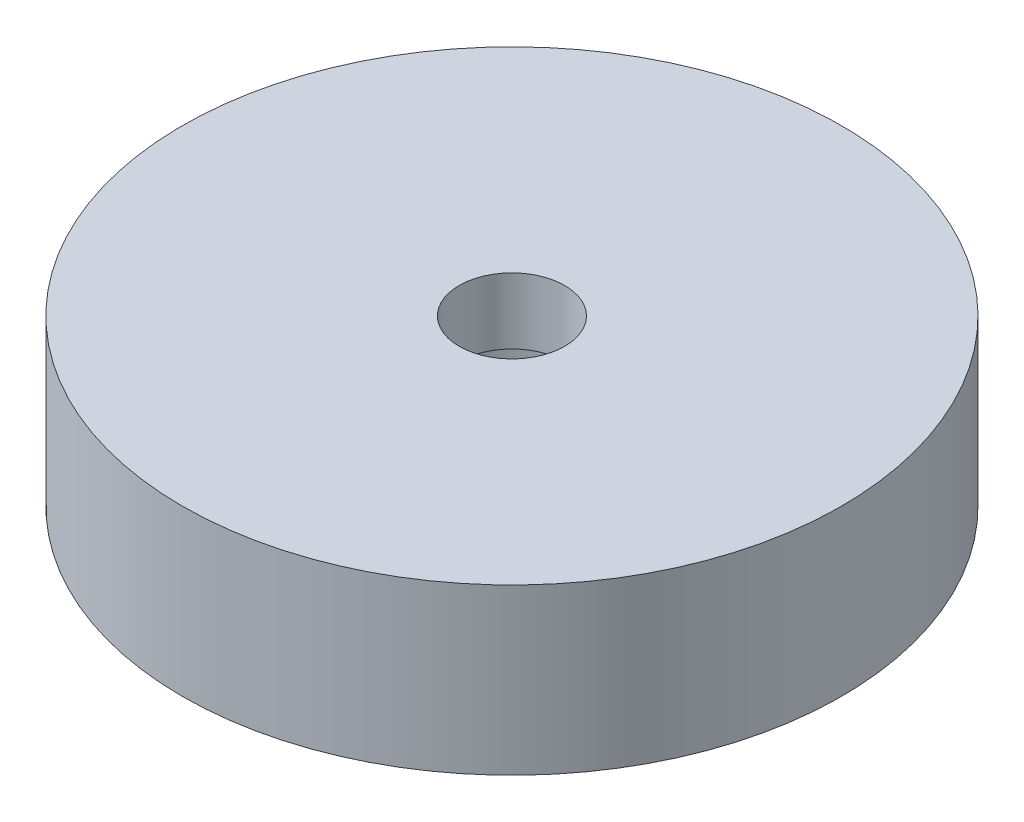
ISO-10303-21;
HEADER;
FILE_DESCRIPTION(('STEP AP214'),'2;1');
FILE_NAME('part.step','',(''),(''),'','','');
FILE_SCHEMA(('AUTOMOTIVE_DESIGN { 1 0 10303 214 1 1 1 1 }'));
ENDSEC;
DATA;
#1=APPLICATION_CONTEXT('core data for automotive mechanical design processes');
#2=APPLICATION_PROTOCOL_DEFINITION('international standard','automotive_design',2000,#1);
#3=PRODUCT_CONTEXT('',#1,'mechanical');
#4=PRODUCT('Part','Part','',(#3));
#5=PRODUCT_RELATED_PRODUCT_CATEGORY('part','',(#4));
#6=PRODUCT_DEFINITION_FORMATION('','',#4);
#7=PRODUCT_DEFINITION_CONTEXT('part definition',#1,'design');
#8=PRODUCT_DEFINITION('design','',#6,#7);
#9=PRODUCT_DEFINITION_SHAPE('','',#8);
#10=(LENGTH_UNIT() NAMED_UNIT(*) SI_UNIT(.MILLI.,.METRE.));
#11=(NAMED_UNIT(*) PLANE_ANGLE_UNIT() SI_UNIT($,.RADIAN.));
#12=(NAMED_UNIT(*) SI_UNIT($,.STERADIAN.) SOLID_ANGLE_UNIT());
#13=UNCERTAINTY_MEASURE_WITH_UNIT(LENGTH_MEASURE(1.E-05),#10,'distance_accuracy_value','');
#14=(GEOMETRIC_REPRESENTATION_CONTEXT(3) GLOBAL_UNCERTAINTY_ASSIGNED_CONTEXT((#13)) GLOBAL_UNIT_ASSIGNED_CONTEXT((#10,
#11,#12)) REPRESENTATION_CONTEXT('',''));
#15=CARTESIAN_POINT('',(0.,0.,0.));
#16=DIRECTION('',(0.,0.,1.));
#17=DIRECTION('',(1.,0.,0.));
#18=AXIS2_PLACEMENT_3D('',#15,#16,#17);
#19=CARTESIAN_POINT('',(0.,5.,0.));
#20=DIRECTION('',(0.,-1.,0.));
#21=DIRECTION('',(0.,0.,-1.));
#22=AXIS2_PLACEMENT_3D('',#19,#20,#21);
#23=CYLINDRICAL_SURFACE('',#22,10.);
#24=CARTESIAN_POINT('',(0.,5.,0.));
#25=DIRECTION('',(0.,1.,0.));
#26=DIRECTION('',(0.,0.,1.));
#27=AXIS2_PLACEMENT_3D('',#24,#25,#26);
#28=CIRCLE('',#27,10.);
#29=CARTESIAN_POINT('',(0.,5.,10.));
#30=VERTEX_POINT('',#29);
#31=EDGE_CURVE('E10',#30,#30,#28,.T.);
#32=ORIENTED_EDGE('',*,*,#31,.F.);
#33=EDGE_LOOP('',(#32));
#34=FACE_BOUND('',#33,.T.);
#35=CARTESIAN_POINT('',(0.,0.,0.));
#36=DIRECTION('',(0.,1.,0.));
#37=DIRECTION('',(0.,0.,1.));
#38=AXIS2_PLACEMENT_3D('',#35,#36,#37);
#39=CIRCLE('',#38,10.);
#40=CARTESIAN_POINT('',(0.,0.,10.));
#41=VERTEX_POINT('',#40);
#42=EDGE_CURVE('E51',#41,#41,#39,.T.);
#43=ORIENTED_EDGE('',*,*,#42,.T.);
#44=EDGE_LOOP('',(#43));
#45=FACE_BOUND('',#44,.T.);
#46=ADVANCED_FACE('F43',(#34,#45),#23,.T.);
#47=CARTESIAN_POINT('',(0.,5.,0.));
#48=DIRECTION('',(0.,1.,0.));
#49=DIRECTION('',(0.,0.,1.));
#50=AXIS2_PLACEMENT_3D('',#47,#48,#49);
#51=PLANE('',#50);
#52=CARTESIAN_POINT('',(0.,5.,0.));
#53=DIRECTION('',(0.,1.,0.));
#54=DIRECTION('',(0.,0.,1.));
#55=AXIS2_PLACEMENT_3D('',#52,#53,#54);
#56=CIRCLE('',#55,1.6);
#57=CARTESIAN_POINT('',(0.,5.,1.6));
#58=VERTEX_POINT('',#57);
#59=EDGE_CURVE('E72',#58,#58,#56,.T.);
#60=ORIENTED_EDGE('',*,*,#59,.F.);
#61=EDGE_LOOP('',(#60));
#62=FACE_BOUND('',#61,.T.);
#63=ORIENTED_EDGE('',*,*,#31,.T.);
#64=EDGE_LOOP('',(#63));
#65=FACE_BOUND('',#64,.T.);
#66=ADVANCED_FACE('F82',(#62,#65),#51,.T.);
#67=CARTESIAN_POINT('',(0.,0.,0.));
#68=DIRECTION('',(0.,1.,0.));
#69=DIRECTION('',(0.,0.,1.));
#70=AXIS2_PLACEMENT_3D('',#67,#68,#69);
#71=PLANE('',#70);
#72=CARTESIAN_POINT('',(0.,0.,0.));
#73=DIRECTION('',(0.,1.,0.));
#74=DIRECTION('',(0.,0.,1.));
#75=AXIS2_PLACEMENT_3D('',#72,#73,#74);
#76=CIRCLE('',#75,3.);
#77=CARTESIAN_POINT('',(0.,0.,3.));
#78=VERTEX_POINT('',#77);
#79=EDGE_CURVE('E57',#78,#78,#76,.T.);
#80=ORIENTED_EDGE('',*,*,#79,.T.);
#81=EDGE_LOOP('',(#80));
#82=FACE_BOUND('',#81,.T.);
#83=ORIENTED_EDGE('',*,*,#42,.F.);
#84=EDGE_LOOP('',(#83));
#85=FACE_BOUND('',#84,.T.);
#86=ADVANCED_FACE('F84',(#82,#85),#71,.F.);
#87=CARTESIAN_POINT('',(0.,-2.,0.));
#88=DIRECTION('',(0.,1.,0.));
#89=DIRECTION('',(0.,0.,1.));
#90=AXIS2_PLACEMENT_3D('',#87,#88,#89);
#91=CYLINDRICAL_SURFACE('',#90,3.);
#92=CARTESIAN_POINT('',(0.,3.,0.));
#93=DIRECTION('',(0.,1.,0.));
#94=DIRECTION('',(0.,0.,1.));
#95=AXIS2_PLACEMENT_3D('',#92,#93,#94);
#96=CIRCLE('',#95,3.);
#97=CARTESIAN_POINT('',(0.,3.,3.));
#98=VERTEX_POINT('',#97);
#99=EDGE_CURVE('E60',#98,#98,#96,.T.);
#100=ORIENTED_EDGE('',*,*,#99,.T.);
#101=EDGE_LOOP('',(#100));
#102=FACE_BOUND('',#101,.T.);
#103=ORIENTED_EDGE('',*,*,#79,.F.);
#104=EDGE_LOOP('',(#103));
#105=FACE_BOUND('',#104,.T.);
#106=ADVANCED_FACE('F91',(#102,#105),#91,.F.);
#107=CARTESIAN_POINT('',(0.,3.,0.));
#108=DIRECTION('',(0.,1.,0.));
#109=DIRECTION('',(0.,0.,1.));
#110=AXIS2_PLACEMENT_3D('',#107,#108,#109);
#111=PLANE('',#110);
#112=CARTESIAN_POINT('',(0.,3.,0.));
#113=DIRECTION('',(0.,1.,0.));
#114=DIRECTION('',(0.,0.,1.));
#115=AXIS2_PLACEMENT_3D('',#112,#113,#114);
#116=CIRCLE('',#115,1.6);
#117=CARTESIAN_POINT('',(0.,3.,1.6));
#118=VERTEX_POINT('',#117);
#119=EDGE_CURVE('E46',#118,#118,#116,.T.);
#120=ORIENTED_EDGE('',*,*,#119,.T.);
#121=EDGE_LOOP('',(#120));
#122=FACE_BOUND('',#121,.T.);
#123=ORIENTED_EDGE('',*,*,#99,.F.);
#124=EDGE_LOOP('',(#123));
#125=FACE_BOUND('',#124,.T.);
#126=ADVANCED_FACE('F96',(#122,#125),#111,.F.);
#127=CARTESIAN_POINT('',(0.,0.,0.));
#128=DIRECTION('',(0.,1.,0.));
#129=DIRECTION('',(0.,0.,1.));
#130=AXIS2_PLACEMENT_3D('',#127,#128,#129);
#131=CYLINDRICAL_SURFACE('',#130,1.6);
#132=ORIENTED_EDGE('',*,*,#59,.T.);
#133=EDGE_LOOP('',(#132));
#134=FACE_BOUND('',#133,.T.);
#135=ORIENTED_EDGE('',*,*,#119,.F.);
#136=EDGE_LOOP('',(#135));
#137=FACE_BOUND('',#136,.T.);
#138=ADVANCED_FACE('F79',(#134,#137),#131,.F.);
#139=CLOSED_SHELL('',(#46,#66,#86,#106,#126,#138));
#140=MANIFOLD_SOLID_BREP('B2',#139);
#141=ADVANCED_BREP_SHAPE_REPRESENTATION('',(#18,#140),#14);
#142=SHAPE_DEFINITION_REPRESENTATION(#9,#141);
ENDSEC;
END-ISO-10303-21;
